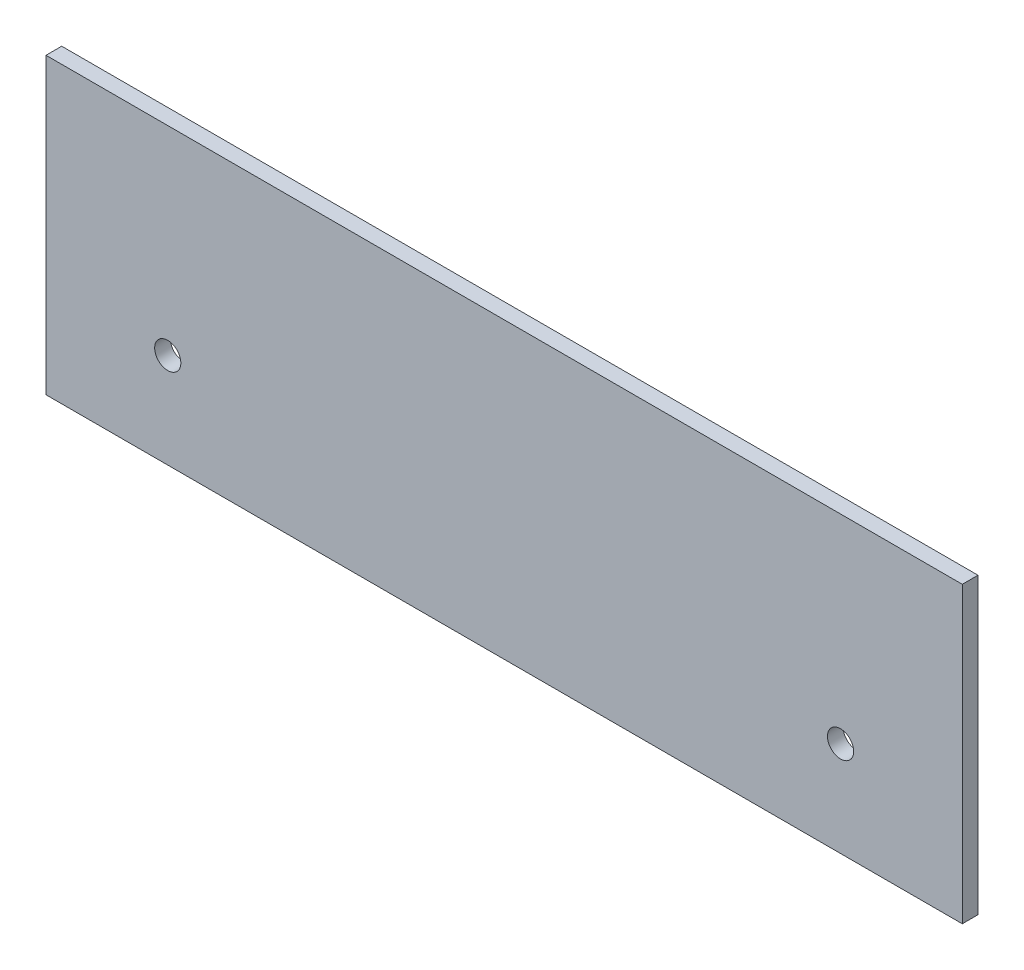
ISO-10303-21;
HEADER;
FILE_DESCRIPTION(('STEP AP214'),'2;1');
FILE_NAME('part.step','',(''),(''),'','','');
FILE_SCHEMA(('AUTOMOTIVE_DESIGN { 1 0 10303 214 1 1 1 1 }'));
ENDSEC;
DATA;
#1=APPLICATION_CONTEXT('core data for automotive mechanical design processes');
#2=APPLICATION_PROTOCOL_DEFINITION('international standard','automotive_design',2000,#1);
#3=PRODUCT_CONTEXT('',#1,'mechanical');
#4=PRODUCT('Part','Part','',(#3));
#5=PRODUCT_RELATED_PRODUCT_CATEGORY('part','',(#4));
#6=PRODUCT_DEFINITION_FORMATION('','',#4);
#7=PRODUCT_DEFINITION_CONTEXT('part definition',#1,'design');
#8=PRODUCT_DEFINITION('design','',#6,#7);
#9=PRODUCT_DEFINITION_SHAPE('','',#8);
#10=(LENGTH_UNIT() NAMED_UNIT(*) SI_UNIT(.MILLI.,.METRE.));
#11=(NAMED_UNIT(*) PLANE_ANGLE_UNIT() SI_UNIT($,.RADIAN.));
#12=(NAMED_UNIT(*) SI_UNIT($,.STERADIAN.) SOLID_ANGLE_UNIT());
#13=UNCERTAINTY_MEASURE_WITH_UNIT(LENGTH_MEASURE(1.E-05),#10,'distance_accuracy_value','');
#14=(GEOMETRIC_REPRESENTATION_CONTEXT(3) GLOBAL_UNCERTAINTY_ASSIGNED_CONTEXT((#13)) GLOBAL_UNIT_ASSIGNED_CONTEXT((#10,
#11,#12)) REPRESENTATION_CONTEXT('',''));
#15=CARTESIAN_POINT('',(0.,0.,0.));
#16=DIRECTION('',(0.,0.,1.));
#17=DIRECTION('',(1.,0.,0.));
#18=AXIS2_PLACEMENT_3D('',#15,#16,#17);
#19=CARTESIAN_POINT('',(-76.2817097489466,211.295712396778,1.16603894672108));
#20=DIRECTION('',(1.,0.,0.));
#21=DIRECTION('',(0.,0.,-1.));
#22=AXIS2_PLACEMENT_3D('',#19,#20,#21);
#23=PLANE('',#22);
#24=DIRECTION('',(0.,-1.,0.));
#25=VECTOR('',#24,1.);
#26=CARTESIAN_POINT('',(-76.2817097489466,211.295712396778,4.16603894672108));
#27=LINE('',#26,#25);
#28=CARTESIAN_POINT('',(-76.2817097489466,56.15750008,4.16603894672108));
#29=VERTEX_POINT('',#28);
#30=CARTESIAN_POINT('',(-76.2817097489466,0.,4.16603894672108));
#31=VERTEX_POINT('',#30);
#32=EDGE_CURVE('E11',#29,#31,#27,.T.);
#33=ORIENTED_EDGE('',*,*,#32,.F.);
#34=DIRECTION('',(0.,0.,1.));
#35=VECTOR('',#34,1.);
#36=CARTESIAN_POINT('',(-76.2817097489466,56.15750008,-174.960372075113));
#37=LINE('',#36,#35);
#38=CARTESIAN_POINT('',(-76.2817097489466,56.15750008,1.16603894672107));
#39=VERTEX_POINT('',#38);
#40=EDGE_CURVE('E102',#39,#29,#37,.T.);
#41=ORIENTED_EDGE('',*,*,#40,.F.);
#42=DIRECTION('',(0.,-1.,0.));
#43=VECTOR('',#42,1.);
#44=CARTESIAN_POINT('',(-76.2817097489466,211.295712396778,1.16603894672108));
#45=LINE('',#44,#43);
#46=CARTESIAN_POINT('',(-76.2817097489466,0.,1.16603894672108));
#47=VERTEX_POINT('',#46);
#48=EDGE_CURVE('E56',#39,#47,#45,.T.);
#49=ORIENTED_EDGE('',*,*,#48,.T.);
#50=DIRECTION('',(0.,0.,1.));
#51=VECTOR('',#50,1.);
#52=CARTESIAN_POINT('',(-76.2817097489466,0.,1.16603894672108));
#53=LINE('',#52,#51);
#54=EDGE_CURVE('E118',#47,#31,#53,.T.);
#55=ORIENTED_EDGE('',*,*,#54,.T.);
#56=EDGE_LOOP('',(#33,#41,#49,#55));
#57=FACE_BOUND('',#56,.T.);
#58=ADVANCED_FACE('F38',(#57),#23,.F.);
#59=CARTESIAN_POINT('',(-76.2817097489466,211.295712396778,4.16603894672108));
#60=DIRECTION('',(0.,0.,-1.));
#61=DIRECTION('',(-1.,0.,0.));
#62=AXIS2_PLACEMENT_3D('',#59,#60,#61);
#63=PLANE('',#62);
#64=CARTESIAN_POINT('',(-53.0317097489677,18.135,4.16603894672108));
#65=DIRECTION('',(0.,0.,1.));
#66=DIRECTION('',(1.,0.,0.));
#67=AXIS2_PLACEMENT_3D('',#64,#65,#66);
#68=CIRCLE('',#67,2.5);
#69=CARTESIAN_POINT('',(-50.5317097489677,18.135,4.16603894672108));
#70=VERTEX_POINT('',#69);
#71=EDGE_CURVE('E119',#70,#70,#68,.T.);
#72=ORIENTED_EDGE('',*,*,#71,.F.);
#73=EDGE_LOOP('',(#72));
#74=FACE_BOUND('',#73,.T.);
#75=CARTESIAN_POINT('',(75.4682902510744,18.135,4.16603894672108));
#76=DIRECTION('',(0.,0.,1.));
#77=DIRECTION('',(1.,0.,0.));
#78=AXIS2_PLACEMENT_3D('',#75,#76,#77);
#79=CIRCLE('',#78,2.50000000000001);
#80=CARTESIAN_POINT('',(77.9682902510744,18.135,4.16603894672108));
#81=VERTEX_POINT('',#80);
#82=EDGE_CURVE('E127',#81,#81,#79,.T.);
#83=ORIENTED_EDGE('',*,*,#82,.F.);
#84=EDGE_LOOP('',(#83));
#85=FACE_BOUND('',#84,.T.);
#86=DIRECTION('',(0.,-1.,0.));
#87=VECTOR('',#86,1.);
#88=CARTESIAN_POINT('',(98.7182902510528,211.295712396778,4.16603894672108));
#89=LINE('',#88,#87);
#90=CARTESIAN_POINT('',(98.7182902510532,56.15750008,4.16603894672108));
#91=VERTEX_POINT('',#90);
#92=CARTESIAN_POINT('',(98.7182902510528,0.,4.16603894672108));
#93=VERTEX_POINT('',#92);
#94=EDGE_CURVE('E46',#91,#93,#89,.T.);
#95=ORIENTED_EDGE('',*,*,#94,.F.);
#96=DIRECTION('',(-1.,0.,0.));
#97=VECTOR('',#96,1.);
#98=CARTESIAN_POINT('',(-76.2817097489466,56.15750008,4.16603894672108));
#99=LINE('',#98,#97);
#100=EDGE_CURVE('E90',#91,#29,#99,.T.);
#101=ORIENTED_EDGE('',*,*,#100,.T.);
#102=ORIENTED_EDGE('',*,*,#32,.T.);
#103=DIRECTION('',(1.,0.,0.));
#104=VECTOR('',#103,1.);
#105=CARTESIAN_POINT('',(-76.2817097489466,0.,4.16603894672108));
#106=LINE('',#105,#104);
#107=EDGE_CURVE('E92',#31,#93,#106,.T.);
#108=ORIENTED_EDGE('',*,*,#107,.T.);
#109=EDGE_LOOP('',(#95,#101,#102,#108));
#110=FACE_BOUND('',#109,.T.);
#111=ADVANCED_FACE('F88',(#74,#85,#110),#63,.F.);
#112=CARTESIAN_POINT('',(98.7182902510528,211.295712396778,1.16603894672108));
#113=DIRECTION('',(-1.,0.,0.));
#114=DIRECTION('',(0.,0.,1.));
#115=AXIS2_PLACEMENT_3D('',#112,#113,#114);
#116=PLANE('',#115);
#117=DIRECTION('',(0.,-1.,0.));
#118=VECTOR('',#117,1.);
#119=CARTESIAN_POINT('',(98.7182902510528,211.295712396778,1.16603894672108));
#120=LINE('',#119,#118);
#121=CARTESIAN_POINT('',(98.7182902510532,56.15750008,1.16603894672107));
#122=VERTEX_POINT('',#121);
#123=CARTESIAN_POINT('',(98.7182902510528,0.,1.16603894672108));
#124=VERTEX_POINT('',#123);
#125=EDGE_CURVE('E64',#122,#124,#120,.T.);
#126=ORIENTED_EDGE('',*,*,#125,.F.);
#127=DIRECTION('',(0.,0.,1.));
#128=VECTOR('',#127,1.);
#129=CARTESIAN_POINT('',(98.7182902510532,56.15750008,-174.960372075113));
#130=LINE('',#129,#128);
#131=EDGE_CURVE('E97',#122,#91,#130,.T.);
#132=ORIENTED_EDGE('',*,*,#131,.T.);
#133=ORIENTED_EDGE('',*,*,#94,.T.);
#134=DIRECTION('',(0.,0.,-1.));
#135=VECTOR('',#134,1.);
#136=CARTESIAN_POINT('',(98.7182902510528,0.,1.16603894672108));
#137=LINE('',#136,#135);
#138=EDGE_CURVE('E135',#93,#124,#137,.T.);
#139=ORIENTED_EDGE('',*,*,#138,.T.);
#140=EDGE_LOOP('',(#126,#132,#133,#139));
#141=FACE_BOUND('',#140,.T.);
#142=ADVANCED_FACE('F98',(#141),#116,.F.);
#143=CARTESIAN_POINT('',(-76.2817097489466,211.295712396778,1.16603894672108));
#144=DIRECTION('',(0.,0.,1.));
#145=DIRECTION('',(1.,0.,0.));
#146=AXIS2_PLACEMENT_3D('',#143,#144,#145);
#147=PLANE('',#146);
#148=CARTESIAN_POINT('',(-53.0317097489677,18.135,1.16603894672107));
#149=DIRECTION('',(0.,0.,1.));
#150=DIRECTION('',(1.,0.,0.));
#151=AXIS2_PLACEMENT_3D('',#148,#149,#150);
#152=CIRCLE('',#151,2.5);
#153=CARTESIAN_POINT('',(-50.5317097489677,18.135,1.16603894672107));
#154=VERTEX_POINT('',#153);
#155=EDGE_CURVE('E114',#154,#154,#152,.T.);
#156=ORIENTED_EDGE('',*,*,#155,.T.);
#157=EDGE_LOOP('',(#156));
#158=FACE_BOUND('',#157,.T.);
#159=CARTESIAN_POINT('',(75.4682902510744,18.135,1.16603894672107));
#160=DIRECTION('',(0.,0.,1.));
#161=DIRECTION('',(1.,0.,0.));
#162=AXIS2_PLACEMENT_3D('',#159,#160,#161);
#163=CIRCLE('',#162,2.50000000000001);
#164=CARTESIAN_POINT('',(77.9682902510744,18.135,1.16603894672107));
#165=VERTEX_POINT('',#164);
#166=EDGE_CURVE('E123',#165,#165,#163,.T.);
#167=ORIENTED_EDGE('',*,*,#166,.T.);
#168=EDGE_LOOP('',(#167));
#169=FACE_BOUND('',#168,.T.);
#170=ORIENTED_EDGE('',*,*,#48,.F.);
#171=DIRECTION('',(1.,0.,0.));
#172=VECTOR('',#171,1.);
#173=CARTESIAN_POINT('',(-76.2817097489466,56.15750008,1.16603894672107));
#174=LINE('',#173,#172);
#175=EDGE_CURVE('E111',#39,#122,#174,.T.);
#176=ORIENTED_EDGE('',*,*,#175,.T.);
#177=ORIENTED_EDGE('',*,*,#125,.T.);
#178=DIRECTION('',(-1.,0.,0.));
#179=VECTOR('',#178,1.);
#180=CARTESIAN_POINT('',(-76.2817097489466,0.,1.16603894672108));
#181=LINE('',#180,#179);
#182=EDGE_CURVE('E138',#124,#47,#181,.T.);
#183=ORIENTED_EDGE('',*,*,#182,.T.);
#184=EDGE_LOOP('',(#170,#176,#177,#183));
#185=FACE_BOUND('',#184,.T.);
#186=ADVANCED_FACE('F144',(#158,#169,#185),#147,.F.);
#187=CARTESIAN_POINT('',(0.,0.,0.));
#188=DIRECTION('',(0.,1.,0.));
#189=DIRECTION('',(0.,0.,1.));
#190=AXIS2_PLACEMENT_3D('',#187,#188,#189);
#191=PLANE('',#190);
#192=ORIENTED_EDGE('',*,*,#54,.F.);
#193=ORIENTED_EDGE('',*,*,#182,.F.);
#194=ORIENTED_EDGE('',*,*,#138,.F.);
#195=ORIENTED_EDGE('',*,*,#107,.F.);
#196=EDGE_LOOP('',(#192,#193,#194,#195));
#197=FACE_BOUND('',#196,.T.);
#198=ADVANCED_FACE('F147',(#197),#191,.F.);
#199=CARTESIAN_POINT('',(75.4682902510744,18.135,1.16603894672107));
#200=DIRECTION('',(0.,0.,1.));
#201=DIRECTION('',(1.,0.,0.));
#202=AXIS2_PLACEMENT_3D('',#199,#200,#201);
#203=CYLINDRICAL_SURFACE('',#202,2.50000000000001);
#204=ORIENTED_EDGE('',*,*,#166,.F.);
#205=EDGE_LOOP('',(#204));
#206=FACE_BOUND('',#205,.T.);
#207=ORIENTED_EDGE('',*,*,#82,.T.);
#208=EDGE_LOOP('',(#207));
#209=FACE_BOUND('',#208,.T.);
#210=ADVANCED_FACE('F150',(#206,#209),#203,.F.);
#211=CARTESIAN_POINT('',(-53.0317097489677,18.135,1.16603894672107));
#212=DIRECTION('',(0.,0.,1.));
#213=DIRECTION('',(1.,0.,0.));
#214=AXIS2_PLACEMENT_3D('',#211,#212,#213);
#215=CYLINDRICAL_SURFACE('',#214,2.5);
#216=ORIENTED_EDGE('',*,*,#155,.F.);
#217=EDGE_LOOP('',(#216));
#218=FACE_BOUND('',#217,.T.);
#219=ORIENTED_EDGE('',*,*,#71,.T.);
#220=EDGE_LOOP('',(#219));
#221=FACE_BOUND('',#220,.T.);
#222=ADVANCED_FACE('F156',(#218,#221),#215,.F.);
#223=CARTESIAN_POINT('',(-76.2817097489466,56.15750008,-174.960372075113));
#224=DIRECTION('',(0.,1.,0.));
#225=DIRECTION('',(0.,0.,1.));
#226=AXIS2_PLACEMENT_3D('',#223,#224,#225);
#227=PLANE('',#226);
#228=ORIENTED_EDGE('',*,*,#175,.F.);
#229=ORIENTED_EDGE('',*,*,#40,.T.);
#230=ORIENTED_EDGE('',*,*,#100,.F.);
#231=ORIENTED_EDGE('',*,*,#131,.F.);
#232=EDGE_LOOP('',(#228,#229,#230,#231));
#233=FACE_BOUND('',#232,.T.);
#234=ADVANCED_FACE('F105',(#233),#227,.T.);
#235=CLOSED_SHELL('',(#58,#111,#142,#186,#198,#210,#222,#234));
#236=MANIFOLD_SOLID_BREP('B2',#235);
#237=ADVANCED_BREP_SHAPE_REPRESENTATION('',(#18,#236),#14);
#238=SHAPE_DEFINITION_REPRESENTATION(#9,#237);
ENDSEC;
END-ISO-10303-21;
